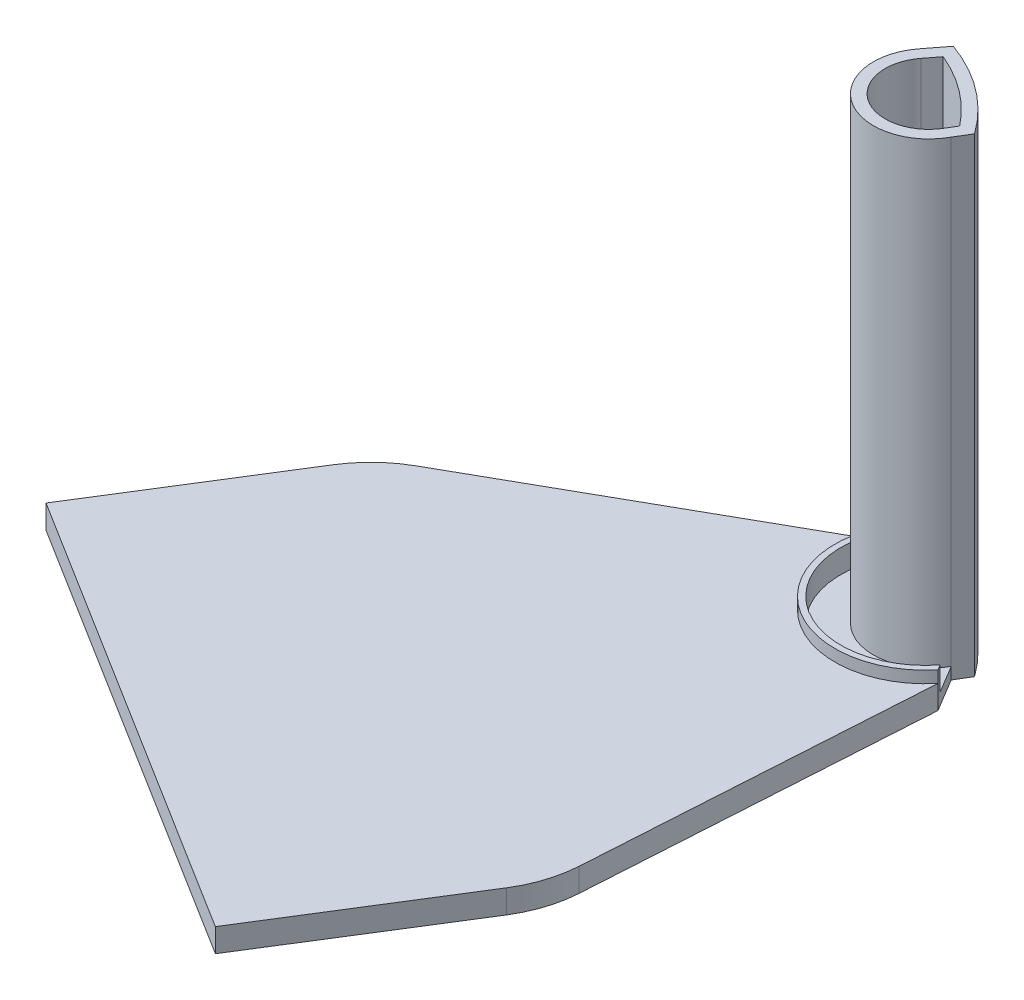
ISO-10303-21;
HEADER;
FILE_DESCRIPTION(('STEP AP214'),'2;1');
FILE_NAME('part.step','',(''),(''),'','','');
FILE_SCHEMA(('AUTOMOTIVE_DESIGN { 1 0 10303 214 1 1 1 1 }'));
ENDSEC;
DATA;
#1=APPLICATION_CONTEXT('core data for automotive mechanical design processes');
#2=APPLICATION_PROTOCOL_DEFINITION('international standard','automotive_design',2000,#1);
#3=PRODUCT_CONTEXT('',#1,'mechanical');
#4=PRODUCT('Part','Part','',(#3));
#5=PRODUCT_RELATED_PRODUCT_CATEGORY('part','',(#4));
#6=PRODUCT_DEFINITION_FORMATION('','',#4);
#7=PRODUCT_DEFINITION_CONTEXT('part definition',#1,'design');
#8=PRODUCT_DEFINITION('design','',#6,#7);
#9=PRODUCT_DEFINITION_SHAPE('','',#8);
#10=(LENGTH_UNIT() NAMED_UNIT(*) SI_UNIT(.MILLI.,.METRE.));
#11=(NAMED_UNIT(*) PLANE_ANGLE_UNIT() SI_UNIT($,.RADIAN.));
#12=(NAMED_UNIT(*) SI_UNIT($,.STERADIAN.) SOLID_ANGLE_UNIT());
#13=UNCERTAINTY_MEASURE_WITH_UNIT(LENGTH_MEASURE(1.E-05),#10,'distance_accuracy_value','');
#14=(GEOMETRIC_REPRESENTATION_CONTEXT(3) GLOBAL_UNCERTAINTY_ASSIGNED_CONTEXT((#13)) GLOBAL_UNIT_ASSIGNED_CONTEXT((#10,
#11,#12)) REPRESENTATION_CONTEXT('',''));
#15=CARTESIAN_POINT('',(0.,0.,0.));
#16=DIRECTION('',(0.,0.,1.));
#17=DIRECTION('',(1.,0.,0.));
#18=AXIS2_PLACEMENT_3D('',#15,#16,#17);
#19=CARTESIAN_POINT('',(-1.03552386225181,63.3853274559972,2.31838307936311));
#20=DIRECTION('',(0.,-1.,0.));
#21=DIRECTION('',(0.,0.,-1.));
#22=AXIS2_PLACEMENT_3D('',#19,#20,#21);
#23=CYLINDRICAL_SURFACE('',#22,7.70000000000083);
#24=CARTESIAN_POINT('',(-1.03552386225181,64.3853274559972,2.31838307936311));
#25=DIRECTION('',(0.,-1.,0.));
#26=DIRECTION('',(0.,0.,-1.));
#27=AXIS2_PLACEMENT_3D('',#24,#25,#26);
#28=CIRCLE('',#27,7.70000000000083);
#29=CARTESIAN_POINT('',(4.91736922909203,64.3853274559972,7.20234293208954));
#30=VERTEX_POINT('',#29);
#31=CARTESIAN_POINT('',(-8.03591182389458,64.3853274559972,-0.888573170182501));
#32=VERTEX_POINT('',#31);
#33=EDGE_CURVE('E85',#30,#32,#28,.T.);
#34=ORIENTED_EDGE('',*,*,#33,.F.);
#35=DIRECTION('',(0.,-1.,0.));
#36=VECTOR('',#35,1.);
#37=CARTESIAN_POINT('',(4.91736922909203,63.3853274559972,7.20234293208954));
#38=LINE('',#37,#36);
#39=CARTESIAN_POINT('',(4.91736922909203,65.3853274559972,7.20234293208954));
#40=VERTEX_POINT('',#39);
#41=EDGE_CURVE('E359',#40,#30,#38,.T.);
#42=ORIENTED_EDGE('',*,*,#41,.F.);
#43=CARTESIAN_POINT('',(-1.03552386225181,65.3853274559972,2.31838307936312));
#44=DIRECTION('',(0.,1.,0.));
#45=DIRECTION('',(0.,0.,1.));
#46=AXIS2_PLACEMENT_3D('',#43,#44,#45);
#47=CIRCLE('',#46,7.70000000000082);
#48=CARTESIAN_POINT('',(-8.03591182389458,65.3853274559972,-0.888573170182501));
#49=VERTEX_POINT('',#48);
#50=EDGE_CURVE('E327',#49,#40,#47,.T.);
#51=ORIENTED_EDGE('',*,*,#50,.F.);
#52=DIRECTION('',(0.,-1.,0.));
#53=VECTOR('',#52,1.);
#54=CARTESIAN_POINT('',(-8.03591182389458,63.3853274559972,-0.888573170182501));
#55=LINE('',#54,#53);
#56=EDGE_CURVE('E71',#49,#32,#55,.T.);
#57=ORIENTED_EDGE('',*,*,#56,.T.);
#58=EDGE_LOOP('',(#34,#42,#51,#57));
#59=FACE_BOUND('',#58,.T.);
#60=ADVANCED_FACE('F63',(#59),#23,.T.);
#61=CARTESIAN_POINT('',(-0.923548018217365,63.3853274559972,2.13912943767619));
#62=DIRECTION('',(0.,1.,0.));
#63=DIRECTION('',(0.,0.,1.));
#64=AXIS2_PLACEMENT_3D('',#61,#62,#63);
#65=PLANE('',#64);
#66=CARTESIAN_POINT('',(-1.03552386225181,63.3853274559972,2.31838307936312));
#67=DIRECTION('',(0.,-1.,0.));
#68=DIRECTION('',(0.,0.,1.));
#69=AXIS2_PLACEMENT_3D('',#66,#67,#68);
#70=CIRCLE('',#69,7.20000000000082);
#71=CARTESIAN_POINT('',(4.64298780521526,63.3853274559972,6.74495119049076));
#72=VERTEX_POINT('',#71);
#73=CARTESIAN_POINT('',(-7.4938171165479,63.3853274559972,-0.864453429401589));
#74=VERTEX_POINT('',#73);
#75=EDGE_CURVE('E326',#72,#74,#70,.T.);
#76=ORIENTED_EDGE('',*,*,#75,.F.);
#77=DIRECTION('',(-0.514421833618273,0.,-0.857537274464973));
#78=VECTOR('',#77,1.);
#79=CARTESIAN_POINT('',(3.22532370851751,63.3853274559972,4.38171595018572));
#80=LINE('',#79,#78);
#81=CARTESIAN_POINT('',(3.22532370851751,63.3853274559972,4.38171595018572));
#82=VERTEX_POINT('',#81);
#83=EDGE_CURVE('E352',#72,#82,#80,.T.);
#84=ORIENTED_EDGE('',*,*,#83,.T.);
#85=CARTESIAN_POINT('',(-0.923548018217365,63.3853274559972,2.13912943767619));
#86=DIRECTION('',(0.,-1.,0.));
#87=DIRECTION('',(0.,0.,1.));
#88=AXIS2_PLACEMENT_3D('',#85,#86,#87);
#89=CIRCLE('',#88,4.71617756991715);
#90=CARTESIAN_POINT('',(-4.66016473829305,63.3853274559972,-0.738374056368699));
#91=VERTEX_POINT('',#90);
#92=EDGE_CURVE('E346',#82,#91,#89,.T.);
#93=ORIENTED_EDGE('',*,*,#92,.T.);
#94=DIRECTION('',(-0.999011627385691,0.,-0.044449615838527));
#95=VECTOR('',#94,1.);
#96=CARTESIAN_POINT('',(-8.03591182389458,63.3853274559972,-0.888573170182501));
#97=LINE('',#96,#95);
#98=EDGE_CURVE('E349',#91,#74,#97,.T.);
#99=ORIENTED_EDGE('',*,*,#98,.T.);
#100=EDGE_LOOP('',(#76,#84,#93,#99));
#101=FACE_BOUND('',#100,.T.);
#102=ADVANCED_FACE('F374',(#101),#65,.T.);
#103=CARTESIAN_POINT('',(-8.03591182389458,63.3853274559972,-0.888573170182501));
#104=DIRECTION('',(-0.044449615838527,0.,0.999011627385691));
#105=DIRECTION('',(0.999011627385691,0.,0.044449615838527));
#106=AXIS2_PLACEMENT_3D('',#103,#104,#105);
#107=PLANE('',#106);
#108=DIRECTION('',(-0.999011627385691,0.,-0.044449615838527));
#109=VECTOR('',#108,1.);
#110=CARTESIAN_POINT('',(-8.03591182389458,62.3853274559972,-0.888573170182501));
#111=LINE('',#110,#109);
#112=CARTESIAN_POINT('',(-4.66016473829305,62.3853274559972,-0.738374056368699));
#113=VERTEX_POINT('',#112);
#114=CARTESIAN_POINT('',(-8.03591182389458,62.3853274559972,-0.888573170182501));
#115=VERTEX_POINT('',#114);
#116=EDGE_CURVE('E345',#113,#115,#111,.T.);
#117=ORIENTED_EDGE('',*,*,#116,.T.);
#118=DIRECTION('',(0.,-1.,0.));
#119=VECTOR('',#118,1.);
#120=CARTESIAN_POINT('',(-8.03591182389458,64.3853274559972,-0.888573170182503));
#121=LINE('',#120,#119);
#122=EDGE_CURVE('E78',#32,#115,#121,.T.);
#123=ORIENTED_EDGE('',*,*,#122,.F.);
#124=ORIENTED_EDGE('',*,*,#56,.F.);
#125=DIRECTION('',(-0.999011627385691,0.,-0.044449615838529));
#126=VECTOR('',#125,1.);
#127=CARTESIAN_POINT('',(-7.4938171165479,65.3853274559972,-0.864453429401589));
#128=LINE('',#127,#126);
#129=CARTESIAN_POINT('',(-7.4938171165479,65.3853274559972,-0.864453429401589));
#130=VERTEX_POINT('',#129);
#131=EDGE_CURVE('E334',#130,#49,#128,.T.);
#132=ORIENTED_EDGE('',*,*,#131,.F.);
#133=DIRECTION('',(0.,-1.,0.));
#134=VECTOR('',#133,1.);
#135=CARTESIAN_POINT('',(-7.4938171165479,65.3853274559972,-0.864453429401589));
#136=LINE('',#135,#134);
#137=EDGE_CURVE('E337',#130,#74,#136,.T.);
#138=ORIENTED_EDGE('',*,*,#137,.T.);
#139=ORIENTED_EDGE('',*,*,#98,.F.);
#140=DIRECTION('',(0.,-1.,0.));
#141=VECTOR('',#140,1.);
#142=CARTESIAN_POINT('',(-4.66016473829305,63.3853274559972,-0.738374056368699));
#143=LINE('',#142,#141);
#144=EDGE_CURVE('E12',#91,#113,#143,.T.);
#145=ORIENTED_EDGE('',*,*,#144,.T.);
#146=EDGE_LOOP('',(#117,#123,#124,#132,#138,#139,#145));
#147=FACE_BOUND('',#146,.T.);
#148=ADVANCED_FACE('F65',(#147),#107,.F.);
#149=CARTESIAN_POINT('',(3.22532370851751,63.3853274559972,4.38171595018572));
#150=DIRECTION('',(-0.857537274464973,0.,0.514421833618273));
#151=DIRECTION('',(0.514421833618273,0.,0.857537274464973));
#152=AXIS2_PLACEMENT_3D('',#149,#150,#151);
#153=PLANE('',#152);
#154=DIRECTION('',(-0.514421833618273,0.,-0.857537274464973));
#155=VECTOR('',#154,1.);
#156=CARTESIAN_POINT('',(3.22532370851751,62.3853274559972,4.38171595018572));
#157=LINE('',#156,#155);
#158=CARTESIAN_POINT('',(4.91736922909203,62.3853274559972,7.20234293208954));
#159=VERTEX_POINT('',#158);
#160=CARTESIAN_POINT('',(3.22532370851751,62.3853274559972,4.38171595018572));
#161=VERTEX_POINT('',#160);
#162=EDGE_CURVE('E350',#159,#161,#157,.T.);
#163=ORIENTED_EDGE('',*,*,#162,.T.);
#164=DIRECTION('',(0.,-1.,0.));
#165=VECTOR('',#164,1.);
#166=CARTESIAN_POINT('',(3.22532370851751,63.3853274559972,4.38171595018572));
#167=LINE('',#166,#165);
#168=EDGE_CURVE('E354',#82,#161,#167,.T.);
#169=ORIENTED_EDGE('',*,*,#168,.F.);
#170=ORIENTED_EDGE('',*,*,#83,.F.);
#171=DIRECTION('',(0.,-1.,0.));
#172=VECTOR('',#171,1.);
#173=CARTESIAN_POINT('',(4.64298780521526,65.3853274559972,6.74495119049077));
#174=LINE('',#173,#172);
#175=CARTESIAN_POINT('',(4.64298780521526,65.3853274559972,6.74495119049077));
#176=VERTEX_POINT('',#175);
#177=EDGE_CURVE('E342',#176,#72,#174,.T.);
#178=ORIENTED_EDGE('',*,*,#177,.F.);
#179=DIRECTION('',(-0.514421833618274,0.,-0.857537274464972));
#180=VECTOR('',#179,1.);
#181=CARTESIAN_POINT('',(4.91736922909203,65.3853274559972,7.20234293208954));
#182=LINE('',#181,#180);
#183=EDGE_CURVE('E330',#40,#176,#182,.T.);
#184=ORIENTED_EDGE('',*,*,#183,.F.);
#185=ORIENTED_EDGE('',*,*,#41,.T.);
#186=DIRECTION('',(0.,-1.,0.));
#187=VECTOR('',#186,1.);
#188=CARTESIAN_POINT('',(4.91736922909203,64.3853274559972,7.20234293208954));
#189=LINE('',#188,#187);
#190=EDGE_CURVE('E264',#30,#159,#189,.T.);
#191=ORIENTED_EDGE('',*,*,#190,.T.);
#192=EDGE_LOOP('',(#163,#169,#170,#178,#184,#185,#191));
#193=FACE_BOUND('',#192,.T.);
#194=ADVANCED_FACE('F418',(#193),#153,.F.);
#195=CARTESIAN_POINT('',(-0.923548018217365,62.3853274559972,2.13912943767619));
#196=DIRECTION('',(0.,1.,0.));
#197=DIRECTION('',(0.,0.,1.));
#198=AXIS2_PLACEMENT_3D('',#195,#196,#197);
#199=PLANE('',#198);
#200=ORIENTED_EDGE('',*,*,#116,.F.);
#201=DIRECTION('',(-0.610134680339323,0.,0.792297716674251));
#202=VECTOR('',#201,1.);
#203=CARTESIAN_POINT('',(-4.66016473829305,62.3853274559972,-0.738374056368699));
#204=LINE('',#203,#202);
#205=CARTESIAN_POINT('',(-3.38107942982045,62.3853274559972,-2.39934564508549));
#206=VERTEX_POINT('',#205);
#207=EDGE_CURVE('E303',#206,#113,#204,.T.);
#208=ORIENTED_EDGE('',*,*,#207,.F.);
#209=CARTESIAN_POINT('',(-8.53122190050178,62.3853274559972,12.0786214002328));
#210=DIRECTION('',(0.,1.,0.));
#211=DIRECTION('',(0.,0.,1.));
#212=AXIS2_PLACEMENT_3D('',#209,#210,#211);
#213=CIRCLE('',#212,15.3667009222421);
#214=CARTESIAN_POINT('',(3.97617613835161,62.3853274559972,3.1511082229071));
#215=VERTEX_POINT('',#214);
#216=EDGE_CURVE('E311',#215,#206,#213,.T.);
#217=ORIENTED_EDGE('',*,*,#216,.F.);
#218=DIRECTION('',(0.520851067551499,0.,-0.853647565117165));
#219=VECTOR('',#218,1.);
#220=CARTESIAN_POINT('',(3.22532370851751,62.3853274559972,4.38171595018572));
#221=LINE('',#220,#219);
#222=EDGE_CURVE('E298',#161,#215,#221,.T.);
#223=ORIENTED_EDGE('',*,*,#222,.F.);
#224=ORIENTED_EDGE('',*,*,#162,.F.);
#225=DIRECTION('',(0.0623620022003065,0.,-0.998053596096707));
#226=VECTOR('',#225,1.);
#227=CARTESIAN_POINT('',(5.34652377871321,62.3853274559972,0.334070163121578));
#228=LINE('',#227,#226);
#229=CARTESIAN_POINT('',(3.12179730759394,62.3853274559972,35.9390247266428));
#230=VERTEX_POINT('',#229);
#231=EDGE_CURVE('E240',#230,#159,#228,.T.);
#232=ORIENTED_EDGE('',*,*,#231,.F.);
#233=CARTESIAN_POINT('',(-6.85873865337313,62.3853274559972,35.3154047046398));
#234=DIRECTION('',(0.,-1.,0.));
#235=DIRECTION('',(0.,0.,-1.));
#236=AXIS2_PLACEMENT_3D('',#233,#234,#235);
#237=CIRCLE('',#236,10.);
#238=CARTESIAN_POINT('',(1.62174230819111,62.3853274559972,40.6145973469718));
#239=VERTEX_POINT('',#238);
#240=EDGE_CURVE('E243',#230,#239,#237,.T.);
#241=ORIENTED_EDGE('',*,*,#240,.T.);
#242=DIRECTION('',(-0.529919264233205,0.,0.848048096156426));
#243=VECTOR('',#242,1.);
#244=CARTESIAN_POINT('',(19.4184128159627,62.3853274559972,12.1339710314184));
#245=LINE('',#244,#243);
#246=CARTESIAN_POINT('',(-7.90363490166856,62.3853274559972,55.858387398051));
#247=VERTEX_POINT('',#246);
#248=EDGE_CURVE('E246',#239,#247,#245,.T.);
#249=ORIENTED_EDGE('',*,*,#248,.T.);
#250=DIRECTION('',(-0.848048096156426,0.,-0.529919264233205));
#251=VECTOR('',#250,1.);
#252=CARTESIAN_POINT('',(-27.3220477176313,62.3853274559972,43.7244163666325));
#253=LINE('',#252,#251);
#254=CARTESIAN_POINT('',(-46.3202136575546,62.3853274559972,31.8530447282868));
#255=VERTEX_POINT('',#254);
#256=EDGE_CURVE('E249',#247,#255,#253,.T.);
#257=ORIENTED_EDGE('',*,*,#256,.T.);
#258=DIRECTION('',(0.529919264233204,0.,-0.848048096156427));
#259=VECTOR('',#258,1.);
#260=CARTESIAN_POINT('',(-18.9981659399234,62.3853274559972,-11.8713716383458));
#261=LINE('',#260,#259);
#262=CARTESIAN_POINT('',(-36.9131476824026,62.3853274559972,16.7985922312837));
#263=VERTEX_POINT('',#262);
#264=EDGE_CURVE('E218',#255,#263,#261,.T.);
#265=ORIENTED_EDGE('',*,*,#264,.T.);
#266=CARTESIAN_POINT('',(-28.4326667208383,62.3853274559972,22.0977848736157));
#267=DIRECTION('',(0.,-1.,0.));
#268=DIRECTION('',(0.,0.,-1.));
#269=AXIS2_PLACEMENT_3D('',#266,#267,#268);
#270=CIRCLE('',#269,10.);
#271=CARTESIAN_POINT('',(-33.3456583111743,62.3853274559972,13.3878759399191));
#272=VERTEX_POINT('',#271);
#273=EDGE_CURVE('E237',#272,#263,#270,.F.);
#274=ORIENTED_EDGE('',*,*,#273,.F.);
#275=DIRECTION('',(0.870990893369664,0.,-0.491299159033593));
#276=VECTOR('',#275,1.);
#277=CARTESIAN_POINT('',(-2.31990276922538,62.3853274559972,-4.11279797317995));
#278=LINE('',#277,#276);
#279=EDGE_CURVE('E205',#272,#115,#278,.T.);
#280=ORIENTED_EDGE('',*,*,#279,.T.);
#281=EDGE_LOOP('',(#200,#208,#217,#223,#224,#232,#241,#249,#257,#265,#274,#280));
#282=FACE_BOUND('',#281,.T.);
#283=CARTESIAN_POINT('',(-8.53122190050178,62.3853274559972,12.0786214002328));
#284=DIRECTION('',(0.,1.,0.));
#285=DIRECTION('',(0.,0.,1.));
#286=AXIS2_PLACEMENT_3D('',#283,#284,#285);
#287=CIRCLE('',#286,14.3667009222421);
#288=CARTESIAN_POINT('',(2.76994466097918,62.3853274559972,3.20812368371101));
#289=VERTEX_POINT('',#288);
#290=CARTESIAN_POINT('',(-3.04352386689751,62.3853274559972,-1.19870007968663));
#291=VERTEX_POINT('',#290);
#292=EDGE_CURVE('E255',#289,#291,#287,.T.);
#293=ORIENTED_EDGE('',*,*,#292,.T.);
#294=DIRECTION('',(-0.610134680339322,0.,0.792297716674252));
#295=VECTOR('',#294,1.);
#296=CARTESIAN_POINT('',(-3.86786702161879,62.3853274559972,-0.128239376029376));
#297=LINE('',#296,#295);
#298=CARTESIAN_POINT('',(-3.8678670216188,62.3853274559972,-0.128239376029375));
#299=VERTEX_POINT('',#298);
#300=EDGE_CURVE('E281',#291,#299,#297,.T.);
#301=ORIENTED_EDGE('',*,*,#300,.T.);
#302=CARTESIAN_POINT('',(-0.923548018217365,62.3853274559972,2.13912943767619));
#303=DIRECTION('',(0.,1.,0.));
#304=DIRECTION('',(0.,0.,1.));
#305=AXIS2_PLACEMENT_3D('',#302,#303,#304);
#306=CIRCLE('',#305,3.71617756991715);
#307=CARTESIAN_POINT('',(2.35724019895624,62.3853274559972,3.88452463797044));
#308=VERTEX_POINT('',#307);
#309=EDGE_CURVE('E284',#299,#308,#306,.T.);
#310=ORIENTED_EDGE('',*,*,#309,.T.);
#311=DIRECTION('',(0.5208510675515,0.,-0.853647565117164));
#312=VECTOR('',#311,1.);
#313=CARTESIAN_POINT('',(2.35724019895624,62.3853274559972,3.88452463797044));
#314=LINE('',#313,#312);
#315=EDGE_CURVE('E271',#308,#289,#314,.T.);
#316=ORIENTED_EDGE('',*,*,#315,.T.);
#317=EDGE_LOOP('',(#293,#301,#310,#316));
#318=FACE_BOUND('',#317,.T.);
#319=ADVANCED_FACE('F395',(#282,#318),#199,.F.);
#320=CARTESIAN_POINT('',(-1.03552386225181,65.3853274559972,2.31838307936312));
#321=DIRECTION('',(0.,-1.,0.));
#322=DIRECTION('',(0.,0.,-1.));
#323=AXIS2_PLACEMENT_3D('',#320,#321,#322);
#324=CYLINDRICAL_SURFACE('',#323,7.20000000000082);
#325=ORIENTED_EDGE('',*,*,#75,.T.);
#326=ORIENTED_EDGE('',*,*,#137,.F.);
#327=CARTESIAN_POINT('',(-1.03552386225181,65.3853274559972,2.31838307936312));
#328=DIRECTION('',(0.,-1.,0.));
#329=DIRECTION('',(0.,0.,1.));
#330=AXIS2_PLACEMENT_3D('',#327,#328,#329);
#331=CIRCLE('',#330,7.20000000000082);
#332=EDGE_CURVE('E332',#176,#130,#331,.T.);
#333=ORIENTED_EDGE('',*,*,#332,.F.);
#334=ORIENTED_EDGE('',*,*,#177,.T.);
#335=EDGE_LOOP('',(#325,#326,#333,#334));
#336=FACE_BOUND('',#335,.T.);
#337=ADVANCED_FACE('F369',(#336),#324,.F.);
#338=CARTESIAN_POINT('',(-1.03552386225181,65.3853274559972,2.31838307936312));
#339=DIRECTION('',(0.,1.,0.));
#340=DIRECTION('',(0.,0.,1.));
#341=AXIS2_PLACEMENT_3D('',#338,#339,#340);
#342=PLANE('',#341);
#343=ORIENTED_EDGE('',*,*,#50,.T.);
#344=ORIENTED_EDGE('',*,*,#183,.T.);
#345=ORIENTED_EDGE('',*,*,#332,.T.);
#346=ORIENTED_EDGE('',*,*,#131,.T.);
#347=EDGE_LOOP('',(#343,#344,#345,#346));
#348=FACE_BOUND('',#347,.T.);
#349=ADVANCED_FACE('F363',(#348),#342,.T.);
#350=CARTESIAN_POINT('',(-0.923548018217369,102.385327455997,2.13912943767619));
#351=DIRECTION('',(0.,1.,0.));
#352=DIRECTION('',(0.,0.,1.));
#353=AXIS2_PLACEMENT_3D('',#350,#351,#352);
#354=PLANE('',#353);
#355=CARTESIAN_POINT('',(-0.923548018217369,102.385327455997,2.13912943767619));
#356=DIRECTION('',(0.,1.,0.));
#357=DIRECTION('',(0.,0.,1.));
#358=AXIS2_PLACEMENT_3D('',#355,#356,#357);
#359=CIRCLE('',#358,4.71617756991715);
#360=CARTESIAN_POINT('',(-4.66016473829305,102.385327455997,-0.738374056368694));
#361=VERTEX_POINT('',#360);
#362=CARTESIAN_POINT('',(3.22532370851751,102.385327455997,4.38171595018572));
#363=VERTEX_POINT('',#362);
#364=EDGE_CURVE('E299',#361,#363,#359,.T.);
#365=ORIENTED_EDGE('',*,*,#364,.T.);
#366=DIRECTION('',(0.520851067551499,0.,-0.853647565117165));
#367=VECTOR('',#366,1.);
#368=CARTESIAN_POINT('',(3.22532370851751,102.385327455997,4.38171595018572));
#369=LINE('',#368,#367);
#370=CARTESIAN_POINT('',(3.97617613835161,102.385327455997,3.15110822290711));
#371=VERTEX_POINT('',#370);
#372=EDGE_CURVE('E302',#363,#371,#369,.T.);
#373=ORIENTED_EDGE('',*,*,#372,.T.);
#374=CARTESIAN_POINT('',(-8.53122190050178,102.385327455997,12.0786214002328));
#375=DIRECTION('',(0.,1.,0.));
#376=DIRECTION('',(0.,0.,1.));
#377=AXIS2_PLACEMENT_3D('',#374,#375,#376);
#378=CIRCLE('',#377,15.3667009222421);
#379=CARTESIAN_POINT('',(-3.38107942982045,102.385327455997,-2.39934564508549));
#380=VERTEX_POINT('',#379);
#381=EDGE_CURVE('E305',#371,#380,#378,.T.);
#382=ORIENTED_EDGE('',*,*,#381,.T.);
#383=DIRECTION('',(-0.610134680339323,0.,0.792297716674251));
#384=VECTOR('',#383,1.);
#385=CARTESIAN_POINT('',(-4.66016473829305,102.385327455997,-0.738374056368694));
#386=LINE('',#385,#384);
#387=EDGE_CURVE('E307',#380,#361,#386,.T.);
#388=ORIENTED_EDGE('',*,*,#387,.T.);
#389=EDGE_LOOP('',(#365,#373,#382,#388));
#390=FACE_BOUND('',#389,.T.);
#391=DIRECTION('',(-0.610134680339322,0.,0.792297716674252));
#392=VECTOR('',#391,1.);
#393=CARTESIAN_POINT('',(-3.8678670216188,102.385327455997,-0.128239376029371));
#394=LINE('',#393,#392);
#395=CARTESIAN_POINT('',(-3.04352386689751,102.385327455997,-1.19870007968662));
#396=VERTEX_POINT('',#395);
#397=CARTESIAN_POINT('',(-3.8678670216188,102.385327455997,-0.12823937602937));
#398=VERTEX_POINT('',#397);
#399=EDGE_CURVE('E270',#396,#398,#394,.T.);
#400=ORIENTED_EDGE('',*,*,#399,.F.);
#401=CARTESIAN_POINT('',(-8.53122190050178,102.385327455997,12.0786214002328));
#402=DIRECTION('',(0.,1.,0.));
#403=DIRECTION('',(0.,0.,1.));
#404=AXIS2_PLACEMENT_3D('',#401,#402,#403);
#405=CIRCLE('',#404,14.3667009222421);
#406=CARTESIAN_POINT('',(2.76994466097918,102.385327455997,3.20812368371102));
#407=VERTEX_POINT('',#406);
#408=EDGE_CURVE('E268',#407,#396,#405,.T.);
#409=ORIENTED_EDGE('',*,*,#408,.F.);
#410=DIRECTION('',(0.5208510675515,0.,-0.853647565117164));
#411=VECTOR('',#410,1.);
#412=CARTESIAN_POINT('',(2.35724019895623,102.385327455997,3.88452463797045));
#413=LINE('',#412,#411);
#414=CARTESIAN_POINT('',(2.35724019895623,102.385327455997,3.88452463797045));
#415=VERTEX_POINT('',#414);
#416=EDGE_CURVE('E276',#415,#407,#413,.T.);
#417=ORIENTED_EDGE('',*,*,#416,.F.);
#418=CARTESIAN_POINT('',(-0.923548018217369,102.385327455997,2.13912943767619));
#419=DIRECTION('',(0.,1.,0.));
#420=DIRECTION('',(0.,0.,1.));
#421=AXIS2_PLACEMENT_3D('',#418,#419,#420);
#422=CIRCLE('',#421,3.71617756991715);
#423=EDGE_CURVE('E273',#398,#415,#422,.T.);
#424=ORIENTED_EDGE('',*,*,#423,.F.);
#425=EDGE_LOOP('',(#400,#409,#417,#424));
#426=FACE_BOUND('',#425,.T.);
#427=ADVANCED_FACE('F387',(#390,#426),#354,.T.);
#428=CARTESIAN_POINT('',(-0.923548018217369,102.385327455997,2.13912943767619));
#429=DIRECTION('',(0.,-1.,0.));
#430=DIRECTION('',(0.,0.,-1.));
#431=AXIS2_PLACEMENT_3D('',#428,#429,#430);
#432=CYLINDRICAL_SURFACE('',#431,4.71617756991715);
#433=ORIENTED_EDGE('',*,*,#92,.F.);
#434=DIRECTION('',(0.,-1.,0.));
#435=VECTOR('',#434,1.);
#436=CARTESIAN_POINT('',(3.22532370851751,102.385327455997,4.38171595018572));
#437=LINE('',#436,#435);
#438=EDGE_CURVE('E323',#363,#82,#437,.T.);
#439=ORIENTED_EDGE('',*,*,#438,.F.);
#440=ORIENTED_EDGE('',*,*,#364,.F.);
#441=DIRECTION('',(0.,-1.,0.));
#442=VECTOR('',#441,1.);
#443=CARTESIAN_POINT('',(-4.66016473829305,102.385327455997,-0.738374056368694));
#444=LINE('',#443,#442);
#445=EDGE_CURVE('E309',#361,#91,#444,.T.);
#446=ORIENTED_EDGE('',*,*,#445,.T.);
#447=EDGE_LOOP('',(#433,#439,#440,#446));
#448=FACE_BOUND('',#447,.T.);
#449=ADVANCED_FACE('F385',(#448),#432,.T.);
#450=CARTESIAN_POINT('',(3.22532370851751,102.385327455997,4.38171595018572));
#451=DIRECTION('',(-0.853647565117165,0.,-0.520851067551499));
#452=DIRECTION('',(-0.520851067551499,0.,0.853647565117165));
#453=AXIS2_PLACEMENT_3D('',#450,#451,#452);
#454=PLANE('',#453);
#455=ORIENTED_EDGE('',*,*,#222,.T.);
#456=DIRECTION('',(0.,-1.,0.));
#457=VECTOR('',#456,1.);
#458=CARTESIAN_POINT('',(3.97617613835161,102.385327455997,3.15110822290711));
#459=LINE('',#458,#457);
#460=EDGE_CURVE('E320',#371,#215,#459,.T.);
#461=ORIENTED_EDGE('',*,*,#460,.F.);
#462=ORIENTED_EDGE('',*,*,#372,.F.);
#463=ORIENTED_EDGE('',*,*,#438,.T.);
#464=ORIENTED_EDGE('',*,*,#168,.T.);
#465=EDGE_LOOP('',(#455,#461,#462,#463,#464));
#466=FACE_BOUND('',#465,.T.);
#467=ADVANCED_FACE('F420',(#466),#454,.F.);
#468=CARTESIAN_POINT('',(-8.53122190050178,102.385327455997,12.0786214002328));
#469=DIRECTION('',(0.,-1.,0.));
#470=DIRECTION('',(0.,0.,-1.));
#471=AXIS2_PLACEMENT_3D('',#468,#469,#470);
#472=CYLINDRICAL_SURFACE('',#471,15.3667009222421);
#473=ORIENTED_EDGE('',*,*,#216,.T.);
#474=DIRECTION('',(0.,-1.,0.));
#475=VECTOR('',#474,1.);
#476=CARTESIAN_POINT('',(-3.38107942982045,102.385327455997,-2.39934564508549));
#477=LINE('',#476,#475);
#478=EDGE_CURVE('E317',#380,#206,#477,.T.);
#479=ORIENTED_EDGE('',*,*,#478,.F.);
#480=ORIENTED_EDGE('',*,*,#381,.F.);
#481=ORIENTED_EDGE('',*,*,#460,.T.);
#482=EDGE_LOOP('',(#473,#479,#480,#481));
#483=FACE_BOUND('',#482,.T.);
#484=ADVANCED_FACE('F421',(#483),#472,.T.);
#485=CARTESIAN_POINT('',(-4.66016473829305,102.385327455997,-0.738374056368694));
#486=DIRECTION('',(0.792297716674252,0.,0.610134680339323));
#487=DIRECTION('',(0.610134680339323,0.,-0.792297716674252));
#488=AXIS2_PLACEMENT_3D('',#485,#486,#487);
#489=PLANE('',#488);
#490=ORIENTED_EDGE('',*,*,#207,.T.);
#491=ORIENTED_EDGE('',*,*,#144,.F.);
#492=ORIENTED_EDGE('',*,*,#445,.F.);
#493=ORIENTED_EDGE('',*,*,#387,.F.);
#494=ORIENTED_EDGE('',*,*,#478,.T.);
#495=EDGE_LOOP('',(#490,#491,#492,#493,#494));
#496=FACE_BOUND('',#495,.T.);
#497=ADVANCED_FACE('F381',(#496),#489,.F.);
#498=CARTESIAN_POINT('',(-8.53122190050178,102.385327455997,12.0786214002328));
#499=DIRECTION('',(0.,-1.,0.));
#500=DIRECTION('',(0.,0.,-1.));
#501=AXIS2_PLACEMENT_3D('',#498,#499,#500);
#502=CYLINDRICAL_SURFACE('',#501,14.3667009222421);
#503=ORIENTED_EDGE('',*,*,#292,.F.);
#504=DIRECTION('',(0.,-1.,0.));
#505=VECTOR('',#504,1.);
#506=CARTESIAN_POINT('',(2.76994466097918,102.385327455997,3.20812368371102));
#507=LINE('',#506,#505);
#508=EDGE_CURVE('E278',#407,#289,#507,.T.);
#509=ORIENTED_EDGE('',*,*,#508,.F.);
#510=ORIENTED_EDGE('',*,*,#408,.T.);
#511=DIRECTION('',(0.,-1.,0.));
#512=VECTOR('',#511,1.);
#513=CARTESIAN_POINT('',(-3.04352386689751,102.385327455997,-1.19870007968662));
#514=LINE('',#513,#512);
#515=EDGE_CURVE('E295',#396,#291,#514,.T.);
#516=ORIENTED_EDGE('',*,*,#515,.T.);
#517=EDGE_LOOP('',(#503,#509,#510,#516));
#518=FACE_BOUND('',#517,.T.);
#519=ADVANCED_FACE('F428',(#518),#502,.F.);
#520=CARTESIAN_POINT('',(-3.8678670216188,102.385327455997,-0.128239376029371));
#521=DIRECTION('',(0.792297716674252,0.,0.610134680339322));
#522=DIRECTION('',(0.610134680339322,0.,-0.792297716674252));
#523=AXIS2_PLACEMENT_3D('',#520,#521,#522);
#524=PLANE('',#523);
#525=ORIENTED_EDGE('',*,*,#300,.F.);
#526=ORIENTED_EDGE('',*,*,#515,.F.);
#527=ORIENTED_EDGE('',*,*,#399,.T.);
#528=DIRECTION('',(0.,-1.,0.));
#529=VECTOR('',#528,1.);
#530=CARTESIAN_POINT('',(-3.8678670216188,102.385327455997,-0.12823937602937));
#531=LINE('',#530,#529);
#532=EDGE_CURVE('E293',#398,#299,#531,.T.);
#533=ORIENTED_EDGE('',*,*,#532,.T.);
#534=EDGE_LOOP('',(#525,#526,#527,#533));
#535=FACE_BOUND('',#534,.T.);
#536=ADVANCED_FACE('F455',(#535),#524,.T.);
#537=CARTESIAN_POINT('',(-0.923548018217369,102.385327455997,2.13912943767619));
#538=DIRECTION('',(0.,-1.,0.));
#539=DIRECTION('',(0.,0.,-1.));
#540=AXIS2_PLACEMENT_3D('',#537,#538,#539);
#541=CYLINDRICAL_SURFACE('',#540,3.71617756991715);
#542=ORIENTED_EDGE('',*,*,#309,.F.);
#543=ORIENTED_EDGE('',*,*,#532,.F.);
#544=ORIENTED_EDGE('',*,*,#423,.T.);
#545=DIRECTION('',(0.,-1.,0.));
#546=VECTOR('',#545,1.);
#547=CARTESIAN_POINT('',(2.35724019895623,102.385327455997,3.88452463797045));
#548=LINE('',#547,#546);
#549=EDGE_CURVE('E291',#415,#308,#548,.T.);
#550=ORIENTED_EDGE('',*,*,#549,.T.);
#551=EDGE_LOOP('',(#542,#543,#544,#550));
#552=FACE_BOUND('',#551,.T.);
#553=ADVANCED_FACE('F459',(#552),#541,.F.);
#554=CARTESIAN_POINT('',(2.35724019895623,102.385327455997,3.88452463797045));
#555=DIRECTION('',(-0.853647565117164,0.,-0.5208510675515));
#556=DIRECTION('',(-0.5208510675515,0.,0.853647565117164));
#557=AXIS2_PLACEMENT_3D('',#554,#555,#556);
#558=PLANE('',#557);
#559=ORIENTED_EDGE('',*,*,#315,.F.);
#560=ORIENTED_EDGE('',*,*,#549,.F.);
#561=ORIENTED_EDGE('',*,*,#416,.T.);
#562=ORIENTED_EDGE('',*,*,#508,.T.);
#563=EDGE_LOOP('',(#559,#560,#561,#562));
#564=FACE_BOUND('',#563,.T.);
#565=ADVANCED_FACE('F463',(#564),#558,.T.);
#566=CARTESIAN_POINT('',(-28.4326667208383,64.3853274559972,22.0977848736157));
#567=DIRECTION('',(0.,-1.,0.));
#568=DIRECTION('',(0.,0.,-1.));
#569=AXIS2_PLACEMENT_3D('',#566,#567,#568);
#570=CYLINDRICAL_SURFACE('',#569,10.);
#571=ORIENTED_EDGE('',*,*,#273,.T.);
#572=DIRECTION('',(0.,-1.,0.));
#573=VECTOR('',#572,1.);
#574=CARTESIAN_POINT('',(-36.9131476824026,64.3853274559972,16.7985922312837));
#575=LINE('',#574,#573);
#576=CARTESIAN_POINT('',(-36.9131476824026,64.3853274559972,16.7985922312837));
#577=VERTEX_POINT('',#576);
#578=EDGE_CURVE('E214',#577,#263,#575,.T.);
#579=ORIENTED_EDGE('',*,*,#578,.F.);
#580=CARTESIAN_POINT('',(-28.4326667208383,64.3853274559972,22.0977848736157));
#581=DIRECTION('',(0.,-1.,0.));
#582=DIRECTION('',(0.,0.,-1.));
#583=AXIS2_PLACEMENT_3D('',#580,#581,#582);
#584=CIRCLE('',#583,10.);
#585=CARTESIAN_POINT('',(-33.3456583111743,64.3853274559972,13.3878759399191));
#586=VERTEX_POINT('',#585);
#587=EDGE_CURVE('E212',#586,#577,#584,.F.);
#588=ORIENTED_EDGE('',*,*,#587,.F.);
#589=DIRECTION('',(0.,-1.,0.));
#590=VECTOR('',#589,1.);
#591=CARTESIAN_POINT('',(-33.3456583111743,64.3853274559972,13.3878759399191));
#592=LINE('',#591,#590);
#593=EDGE_CURVE('E199',#586,#272,#592,.T.);
#594=ORIENTED_EDGE('',*,*,#593,.T.);
#595=EDGE_LOOP('',(#571,#579,#588,#594));
#596=FACE_BOUND('',#595,.T.);
#597=ADVANCED_FACE('F213',(#596),#570,.T.);
#598=CARTESIAN_POINT('',(-18.9981659399234,64.3853274559972,-11.8713716383458));
#599=DIRECTION('',(-0.848048096156427,0.,-0.529919264233204));
#600=DIRECTION('',(-0.529919264233204,0.,0.848048096156427));
#601=AXIS2_PLACEMENT_3D('',#598,#599,#600);
#602=PLANE('',#601);
#603=ORIENTED_EDGE('',*,*,#264,.F.);
#604=DIRECTION('',(0.,-1.,0.));
#605=VECTOR('',#604,1.);
#606=CARTESIAN_POINT('',(-46.3202136575546,64.3853274559972,31.8530447282868));
#607=LINE('',#606,#605);
#608=CARTESIAN_POINT('',(-46.3202136575546,64.3853274559972,31.8530447282868));
#609=VERTEX_POINT('',#608);
#610=EDGE_CURVE('E256',#609,#255,#607,.T.);
#611=ORIENTED_EDGE('',*,*,#610,.F.);
#612=DIRECTION('',(0.529919264233204,0.,-0.848048096156427));
#613=VECTOR('',#612,1.);
#614=CARTESIAN_POINT('',(-18.9981659399234,64.3853274559972,-11.8713716383458));
#615=LINE('',#614,#613);
#616=EDGE_CURVE('E209',#609,#577,#615,.T.);
#617=ORIENTED_EDGE('',*,*,#616,.T.);
#618=ORIENTED_EDGE('',*,*,#578,.T.);
#619=EDGE_LOOP('',(#603,#611,#617,#618));
#620=FACE_BOUND('',#619,.T.);
#621=ADVANCED_FACE('F401',(#620),#602,.T.);
#622=CARTESIAN_POINT('',(-27.3220477176313,64.3853274559972,43.7244163666325));
#623=DIRECTION('',(-0.529919264233205,0.,0.848048096156426));
#624=DIRECTION('',(0.848048096156426,0.,0.529919264233205));
#625=AXIS2_PLACEMENT_3D('',#622,#623,#624);
#626=PLANE('',#625);
#627=ORIENTED_EDGE('',*,*,#256,.F.);
#628=DIRECTION('',(0.,-1.,0.));
#629=VECTOR('',#628,1.);
#630=CARTESIAN_POINT('',(-7.90363490166856,64.3853274559972,55.858387398051));
#631=LINE('',#630,#629);
#632=CARTESIAN_POINT('',(-7.90363490166856,64.3853274559972,55.858387398051));
#633=VERTEX_POINT('',#632);
#634=EDGE_CURVE('E258',#633,#247,#631,.T.);
#635=ORIENTED_EDGE('',*,*,#634,.F.);
#636=DIRECTION('',(-0.848048096156426,0.,-0.529919264233205));
#637=VECTOR('',#636,1.);
#638=CARTESIAN_POINT('',(-27.3220477176313,64.3853274559972,43.7244163666325));
#639=LINE('',#638,#637);
#640=EDGE_CURVE('E233',#633,#609,#639,.T.);
#641=ORIENTED_EDGE('',*,*,#640,.T.);
#642=ORIENTED_EDGE('',*,*,#610,.T.);
#643=EDGE_LOOP('',(#627,#635,#641,#642));
#644=FACE_BOUND('',#643,.T.);
#645=ADVANCED_FACE('F478',(#644),#626,.T.);
#646=CARTESIAN_POINT('',(19.4184128159627,64.3853274559972,12.1339710314184));
#647=DIRECTION('',(0.848048096156426,0.,0.529919264233205));
#648=DIRECTION('',(0.529919264233205,0.,-0.848048096156426));
#649=AXIS2_PLACEMENT_3D('',#646,#647,#648);
#650=PLANE('',#649);
#651=ORIENTED_EDGE('',*,*,#248,.F.);
#652=DIRECTION('',(0.,-1.,0.));
#653=VECTOR('',#652,1.);
#654=CARTESIAN_POINT('',(1.62174230819111,64.3853274559972,40.6145973469718));
#655=LINE('',#654,#653);
#656=CARTESIAN_POINT('',(1.62174230819111,64.3853274559972,40.6145973469718));
#657=VERTEX_POINT('',#656);
#658=EDGE_CURVE('E260',#657,#239,#655,.T.);
#659=ORIENTED_EDGE('',*,*,#658,.F.);
#660=DIRECTION('',(-0.529919264233205,0.,0.848048096156426));
#661=VECTOR('',#660,1.);
#662=CARTESIAN_POINT('',(19.4184128159627,64.3853274559972,12.1339710314184));
#663=LINE('',#662,#661);
#664=EDGE_CURVE('E230',#657,#633,#663,.T.);
#665=ORIENTED_EDGE('',*,*,#664,.T.);
#666=ORIENTED_EDGE('',*,*,#634,.T.);
#667=EDGE_LOOP('',(#651,#659,#665,#666));
#668=FACE_BOUND('',#667,.T.);
#669=ADVANCED_FACE('F408',(#668),#650,.T.);
#670=CARTESIAN_POINT('',(-6.85873865337313,64.3853274559972,35.3154047046398));
#671=DIRECTION('',(0.,-1.,0.));
#672=DIRECTION('',(0.,0.,-1.));
#673=AXIS2_PLACEMENT_3D('',#670,#671,#672);
#674=CYLINDRICAL_SURFACE('',#673,10.);
#675=ORIENTED_EDGE('',*,*,#240,.F.);
#676=DIRECTION('',(0.,-1.,0.));
#677=VECTOR('',#676,1.);
#678=CARTESIAN_POINT('',(3.12179730759394,64.3853274559972,35.9390247266428));
#679=LINE('',#678,#677);
#680=CARTESIAN_POINT('',(3.12179730759394,64.3853274559972,35.9390247266428));
#681=VERTEX_POINT('',#680);
#682=EDGE_CURVE('E262',#681,#230,#679,.T.);
#683=ORIENTED_EDGE('',*,*,#682,.F.);
#684=CARTESIAN_POINT('',(-6.85873865337313,64.3853274559972,35.3154047046398));
#685=DIRECTION('',(0.,-1.,0.));
#686=DIRECTION('',(0.,0.,-1.));
#687=AXIS2_PLACEMENT_3D('',#684,#685,#686);
#688=CIRCLE('',#687,10.);
#689=EDGE_CURVE('E227',#681,#657,#688,.T.);
#690=ORIENTED_EDGE('',*,*,#689,.T.);
#691=ORIENTED_EDGE('',*,*,#658,.T.);
#692=EDGE_LOOP('',(#675,#683,#690,#691));
#693=FACE_BOUND('',#692,.T.);
#694=ADVANCED_FACE('F411',(#693),#674,.T.);
#695=CARTESIAN_POINT('',(5.34652377871321,64.3853274559972,0.334070163121578));
#696=DIRECTION('',(-0.998053596096707,0.,-0.0623620022003065));
#697=DIRECTION('',(-0.0623620022003065,0.,0.998053596096707));
#698=AXIS2_PLACEMENT_3D('',#695,#696,#697);
#699=PLANE('',#698);
#700=ORIENTED_EDGE('',*,*,#231,.T.);
#701=ORIENTED_EDGE('',*,*,#190,.F.);
#702=DIRECTION('',(0.0623620022003065,0.,-0.998053596096707));
#703=VECTOR('',#702,1.);
#704=CARTESIAN_POINT('',(5.34652377871321,64.3853274559972,0.334070163121578));
#705=LINE('',#704,#703);
#706=EDGE_CURVE('E223',#681,#30,#705,.T.);
#707=ORIENTED_EDGE('',*,*,#706,.F.);
#708=ORIENTED_EDGE('',*,*,#682,.T.);
#709=EDGE_LOOP('',(#700,#701,#707,#708));
#710=FACE_BOUND('',#709,.T.);
#711=ADVANCED_FACE('F415',(#710),#699,.F.);
#712=CARTESIAN_POINT('',(-2.31990276922538,64.3853274559972,-4.11279797317995));
#713=DIRECTION('',(-0.491299159033593,0.,-0.870990893369664));
#714=DIRECTION('',(-0.870990893369664,0.,0.491299159033593));
#715=AXIS2_PLACEMENT_3D('',#712,#713,#714);
#716=PLANE('',#715);
#717=ORIENTED_EDGE('',*,*,#279,.F.);
#718=ORIENTED_EDGE('',*,*,#593,.F.);
#719=DIRECTION('',(0.870990893369664,0.,-0.491299159033593));
#720=VECTOR('',#719,1.);
#721=CARTESIAN_POINT('',(-2.31990276922538,64.3853274559972,-4.11279797317995));
#722=LINE('',#721,#720);
#723=EDGE_CURVE('E203',#586,#32,#722,.T.);
#724=ORIENTED_EDGE('',*,*,#723,.T.);
#725=ORIENTED_EDGE('',*,*,#122,.T.);
#726=EDGE_LOOP('',(#717,#718,#724,#725));
#727=FACE_BOUND('',#726,.T.);
#728=ADVANCED_FACE('F201',(#727),#716,.T.);
#729=CARTESIAN_POINT('',(0.,64.3853274559972,0.));
#730=DIRECTION('',(0.,-1.,0.));
#731=DIRECTION('',(0.,0.,-1.));
#732=AXIS2_PLACEMENT_3D('',#729,#730,#731);
#733=PLANE('',#732);
#734=ORIENTED_EDGE('',*,*,#587,.T.);
#735=ORIENTED_EDGE('',*,*,#616,.F.);
#736=ORIENTED_EDGE('',*,*,#640,.F.);
#737=ORIENTED_EDGE('',*,*,#664,.F.);
#738=ORIENTED_EDGE('',*,*,#689,.F.);
#739=ORIENTED_EDGE('',*,*,#706,.T.);
#740=ORIENTED_EDGE('',*,*,#33,.T.);
#741=ORIENTED_EDGE('',*,*,#723,.F.);
#742=EDGE_LOOP('',(#734,#735,#736,#737,#738,#739,#740,#741));
#743=FACE_BOUND('',#742,.T.);
#744=ADVANCED_FACE('F220',(#743),#733,.F.);
#745=CLOSED_SHELL('',(#60,#102,#148,#194,#319,#337,#349,#427,#449,#467,#484,#497,#519,#536,#553,
#565,#597,#621,#645,#669,#694,#711,#728,#744));
#746=MANIFOLD_SOLID_BREP('B2',#745);
#747=ADVANCED_BREP_SHAPE_REPRESENTATION('',(#18,#746),#14);
#748=SHAPE_DEFINITION_REPRESENTATION(#9,#747);
ENDSEC;
END-ISO-10303-21;
